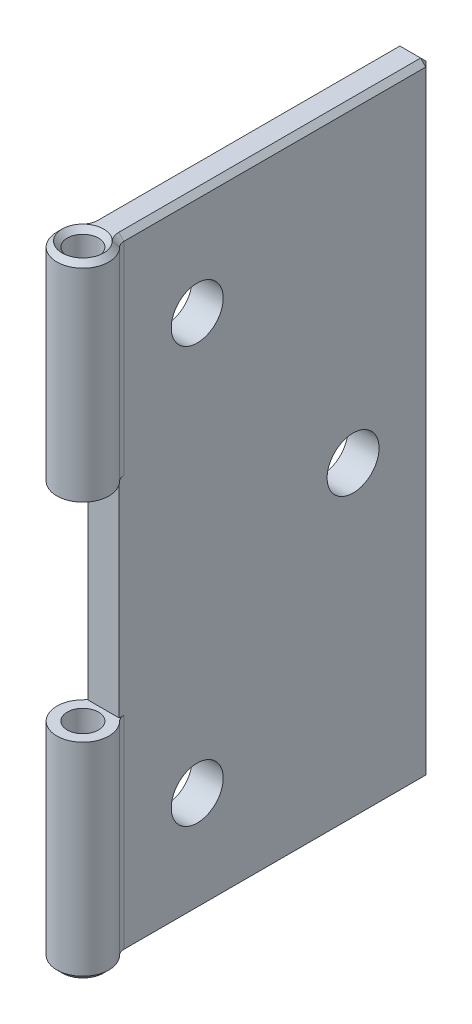
ISO-10303-21;
HEADER;
FILE_DESCRIPTION(('STEP AP214'),'2;1');
FILE_NAME('part.step','',(''),(''),'','','');
FILE_SCHEMA(('AUTOMOTIVE_DESIGN { 1 0 10303 214 1 1 1 1 }'));
ENDSEC;
DATA;
#1=APPLICATION_CONTEXT('core data for automotive mechanical design processes');
#2=APPLICATION_PROTOCOL_DEFINITION('international standard','automotive_design',2000,#1);
#3=PRODUCT_CONTEXT('',#1,'mechanical');
#4=PRODUCT('Part','Part','',(#3));
#5=PRODUCT_RELATED_PRODUCT_CATEGORY('part','',(#4));
#6=PRODUCT_DEFINITION_FORMATION('','',#4);
#7=PRODUCT_DEFINITION_CONTEXT('part definition',#1,'design');
#8=PRODUCT_DEFINITION('design','',#6,#7);
#9=PRODUCT_DEFINITION_SHAPE('','',#8);
#10=(LENGTH_UNIT() NAMED_UNIT(*) SI_UNIT(.MILLI.,.METRE.));
#11=(NAMED_UNIT(*) PLANE_ANGLE_UNIT() SI_UNIT($,.RADIAN.));
#12=(NAMED_UNIT(*) SI_UNIT($,.STERADIAN.) SOLID_ANGLE_UNIT());
#13=UNCERTAINTY_MEASURE_WITH_UNIT(LENGTH_MEASURE(1.E-05),#10,'distance_accuracy_value','');
#14=(GEOMETRIC_REPRESENTATION_CONTEXT(3) GLOBAL_UNCERTAINTY_ASSIGNED_CONTEXT((#13)) GLOBAL_UNIT_ASSIGNED_CONTEXT((#10,
#11,#12)) REPRESENTATION_CONTEXT('',''));
#15=CARTESIAN_POINT('',(0.,0.,0.));
#16=DIRECTION('',(0.,0.,1.));
#17=DIRECTION('',(1.,0.,0.));
#18=AXIS2_PLACEMENT_3D('',#15,#16,#17);
#19=CARTESIAN_POINT('',(1.5,-30.,15.));
#20=DIRECTION('',(0.,0.,-1.));
#21=DIRECTION('',(-1.,0.,0.));
#22=AXIS2_PLACEMENT_3D('',#19,#20,#21);
#23=PLANE('',#22);
#24=DIRECTION('',(-1.,0.,0.));
#25=VECTOR('',#24,1.);
#26=CARTESIAN_POINT('',(-1.5,-9.99999999999999,15.));
#27=LINE('',#26,#25);
#28=CARTESIAN_POINT('',(1.5,-9.99999999999999,15.));
#29=VERTEX_POINT('',#28);
#30=CARTESIAN_POINT('',(-1.5,-9.99999999999999,15.));
#31=VERTEX_POINT('',#30);
#32=EDGE_CURVE('E211',#29,#31,#27,.T.);
#33=ORIENTED_EDGE('',*,*,#32,.F.);
#34=DIRECTION('',(0.,-1.,0.));
#35=VECTOR('',#34,1.);
#36=CARTESIAN_POINT('',(1.5,-30.,15.));
#37=LINE('',#36,#35);
#38=CARTESIAN_POINT('',(1.5,9.99999999999999,15.));
#39=VERTEX_POINT('',#38);
#40=EDGE_CURVE('E226',#39,#29,#37,.T.);
#41=ORIENTED_EDGE('',*,*,#40,.F.);
#42=DIRECTION('',(-1.,0.,0.));
#43=VECTOR('',#42,1.);
#44=CARTESIAN_POINT('',(-1.5,9.99999999999999,15.));
#45=LINE('',#44,#43);
#46=CARTESIAN_POINT('',(-1.5,9.99999999999999,15.));
#47=VERTEX_POINT('',#46);
#48=EDGE_CURVE('E224',#39,#47,#45,.T.);
#49=ORIENTED_EDGE('',*,*,#48,.T.);
#50=DIRECTION('',(0.,-1.,0.));
#51=VECTOR('',#50,1.);
#52=CARTESIAN_POINT('',(-1.5,-30.,15.));
#53=LINE('',#52,#51);
#54=EDGE_CURVE('E201',#47,#31,#53,.T.);
#55=ORIENTED_EDGE('',*,*,#54,.T.);
#56=EDGE_LOOP('',(#33,#41,#49,#55));
#57=FACE_BOUND('',#56,.T.);
#58=ADVANCED_FACE('F55',(#57),#23,.F.);
#59=CARTESIAN_POINT('',(1.5,0.,0.));
#60=DIRECTION('',(1.,0.,0.));
#61=DIRECTION('',(0.,0.,-1.));
#62=AXIS2_PLACEMENT_3D('',#59,#60,#61);
#63=PLANE('',#62);
#64=CARTESIAN_POINT('',(1.5,0.,-7.5));
#65=DIRECTION('',(1.,0.,0.));
#66=DIRECTION('',(0.,0.,-1.));
#67=AXIS2_PLACEMENT_3D('',#64,#65,#66);
#68=CIRCLE('',#67,2.5);
#69=CARTESIAN_POINT('',(1.5,0.,-10.));
#70=VERTEX_POINT('',#69);
#71=EDGE_CURVE('E489',#70,#70,#68,.T.);
#72=ORIENTED_EDGE('',*,*,#71,.F.);
#73=EDGE_LOOP('',(#72));
#74=FACE_BOUND('',#73,.T.);
#75=DIRECTION('',(0.,-1.,0.));
#76=VECTOR('',#75,1.);
#77=CARTESIAN_POINT('',(1.5,0.,14.5505102572168));
#78=LINE('',#77,#76);
#79=CARTESIAN_POINT('',(1.5,-9.99999999999999,14.5505102572168));
#80=VERTEX_POINT('',#79);
#81=CARTESIAN_POINT('',(1.5,-29.5,14.5505102572168));
#82=VERTEX_POINT('',#81);
#83=EDGE_CURVE('E266',#80,#82,#78,.T.);
#84=ORIENTED_EDGE('',*,*,#83,.T.);
#85=DIRECTION('',(0.,0.,-1.));
#86=VECTOR('',#85,1.);
#87=CARTESIAN_POINT('',(1.5,-29.5,-15.));
#88=LINE('',#87,#86);
#89=CARTESIAN_POINT('',(1.5,-29.5,-14.5));
#90=VERTEX_POINT('',#89);
#91=EDGE_CURVE('E338',#82,#90,#88,.T.);
#92=ORIENTED_EDGE('',*,*,#91,.T.);
#93=DIRECTION('',(0.,1.,0.));
#94=VECTOR('',#93,1.);
#95=CARTESIAN_POINT('',(1.5,30.,-14.5));
#96=LINE('',#95,#94);
#97=CARTESIAN_POINT('',(1.5,29.5,-14.5));
#98=VERTEX_POINT('',#97);
#99=EDGE_CURVE('E335',#90,#98,#96,.T.);
#100=ORIENTED_EDGE('',*,*,#99,.T.);
#101=DIRECTION('',(0.,0.,1.));
#102=VECTOR('',#101,1.);
#103=CARTESIAN_POINT('',(1.5,29.5,14.5505102572168));
#104=LINE('',#103,#102);
#105=CARTESIAN_POINT('',(1.5,29.5,14.5505102572168));
#106=VERTEX_POINT('',#105);
#107=EDGE_CURVE('E332',#98,#106,#104,.T.);
#108=ORIENTED_EDGE('',*,*,#107,.T.);
#109=DIRECTION('',(0.,-1.,0.));
#110=VECTOR('',#109,1.);
#111=CARTESIAN_POINT('',(1.5,9.99999999999999,14.5505102572168));
#112=LINE('',#111,#110);
#113=CARTESIAN_POINT('',(1.5,9.99999999999999,14.5505102572168));
#114=VERTEX_POINT('',#113);
#115=EDGE_CURVE('E261',#106,#114,#112,.T.);
#116=ORIENTED_EDGE('',*,*,#115,.T.);
#117=DIRECTION('',(0.,0.,1.));
#118=VECTOR('',#117,1.);
#119=CARTESIAN_POINT('',(1.5,10.,0.));
#120=LINE('',#119,#118);
#121=EDGE_CURVE('E258',#114,#39,#120,.T.);
#122=ORIENTED_EDGE('',*,*,#121,.T.);
#123=ORIENTED_EDGE('',*,*,#40,.T.);
#124=DIRECTION('',(0.,0.,-1.));
#125=VECTOR('',#124,1.);
#126=CARTESIAN_POINT('',(1.5,-10.,0.));
#127=LINE('',#126,#125);
#128=EDGE_CURVE('E215',#29,#80,#127,.T.);
#129=ORIENTED_EDGE('',*,*,#128,.T.);
#130=EDGE_LOOP('',(#84,#92,#100,#108,#116,#122,#123,#129));
#131=FACE_BOUND('',#130,.T.);
#132=CARTESIAN_POINT('',(1.5,20.,7.5));
#133=DIRECTION('',(1.,0.,0.));
#134=DIRECTION('',(0.,0.,-1.));
#135=AXIS2_PLACEMENT_3D('',#132,#133,#134);
#136=CIRCLE('',#135,2.5);
#137=CARTESIAN_POINT('',(1.5,20.,5.));
#138=VERTEX_POINT('',#137);
#139=EDGE_CURVE('E227',#138,#138,#136,.T.);
#140=ORIENTED_EDGE('',*,*,#139,.F.);
#141=EDGE_LOOP('',(#140));
#142=FACE_BOUND('',#141,.T.);
#143=CARTESIAN_POINT('',(1.5,-20.,7.5));
#144=DIRECTION('',(1.,0.,0.));
#145=DIRECTION('',(0.,0.,-1.));
#146=AXIS2_PLACEMENT_3D('',#143,#144,#145);
#147=CIRCLE('',#146,2.5);
#148=CARTESIAN_POINT('',(1.5,-20.,5.));
#149=VERTEX_POINT('',#148);
#150=EDGE_CURVE('E481',#149,#149,#147,.T.);
#151=ORIENTED_EDGE('',*,*,#150,.F.);
#152=EDGE_LOOP('',(#151));
#153=FACE_BOUND('',#152,.T.);
#154=ADVANCED_FACE('F518',(#74,#131,#142,#153),#63,.T.);
#155=CARTESIAN_POINT('',(-1.5,0.,0.));
#156=DIRECTION('',(1.,0.,0.));
#157=DIRECTION('',(0.,0.,-1.));
#158=AXIS2_PLACEMENT_3D('',#155,#156,#157);
#159=PLANE('',#158);
#160=DIRECTION('',(0.,-1.,0.));
#161=VECTOR('',#160,1.);
#162=CARTESIAN_POINT('',(-1.5,0.,-14.5));
#163=LINE('',#162,#161);
#164=CARTESIAN_POINT('',(-1.5,29.5,-14.5));
#165=VERTEX_POINT('',#164);
#166=CARTESIAN_POINT('',(-1.5,-29.5,-14.5));
#167=VERTEX_POINT('',#166);
#168=EDGE_CURVE('E350',#165,#167,#163,.T.);
#169=ORIENTED_EDGE('',*,*,#168,.T.);
#170=DIRECTION('',(0.,0.,1.));
#171=VECTOR('',#170,1.);
#172=CARTESIAN_POINT('',(-1.5,-29.5,0.));
#173=LINE('',#172,#171);
#174=CARTESIAN_POINT('',(-1.5,-29.5,14.5505102572168));
#175=VERTEX_POINT('',#174);
#176=EDGE_CURVE('E353',#167,#175,#173,.T.);
#177=ORIENTED_EDGE('',*,*,#176,.T.);
#178=DIRECTION('',(0.,1.,0.));
#179=VECTOR('',#178,1.);
#180=CARTESIAN_POINT('',(-1.5,-9.99999999999999,14.5505102572168));
#181=LINE('',#180,#179);
#182=CARTESIAN_POINT('',(-1.5,-9.99999999999999,14.5505102572168));
#183=VERTEX_POINT('',#182);
#184=EDGE_CURVE('E204',#175,#183,#181,.T.);
#185=ORIENTED_EDGE('',*,*,#184,.T.);
#186=DIRECTION('',(0.,0.,1.));
#187=VECTOR('',#186,1.);
#188=CARTESIAN_POINT('',(-1.5,-9.99999999999999,17.));
#189=LINE('',#188,#187);
#190=EDGE_CURVE('E195',#183,#31,#189,.T.);
#191=ORIENTED_EDGE('',*,*,#190,.T.);
#192=ORIENTED_EDGE('',*,*,#54,.F.);
#193=DIRECTION('',(0.,0.,-1.));
#194=VECTOR('',#193,1.);
#195=CARTESIAN_POINT('',(-1.5,9.99999999999999,17.));
#196=LINE('',#195,#194);
#197=CARTESIAN_POINT('',(-1.5,9.99999999999999,14.5505102572168));
#198=VERTEX_POINT('',#197);
#199=EDGE_CURVE('E208',#47,#198,#196,.T.);
#200=ORIENTED_EDGE('',*,*,#199,.T.);
#201=DIRECTION('',(0.,1.,0.));
#202=VECTOR('',#201,1.);
#203=CARTESIAN_POINT('',(-1.5,0.,14.5505102572168));
#204=LINE('',#203,#202);
#205=CARTESIAN_POINT('',(-1.5,29.5,14.5505102572168));
#206=VERTEX_POINT('',#205);
#207=EDGE_CURVE('E244',#198,#206,#204,.T.);
#208=ORIENTED_EDGE('',*,*,#207,.T.);
#209=DIRECTION('',(0.,0.,-1.));
#210=VECTOR('',#209,1.);
#211=CARTESIAN_POINT('',(-1.5,29.5,0.));
#212=LINE('',#211,#210);
#213=EDGE_CURVE('E347',#206,#165,#212,.T.);
#214=ORIENTED_EDGE('',*,*,#213,.T.);
#215=EDGE_LOOP('',(#169,#177,#185,#191,#192,#200,#208,#214));
#216=FACE_BOUND('',#215,.T.);
#217=CARTESIAN_POINT('',(-1.5,20.,7.5));
#218=DIRECTION('',(1.,0.,0.));
#219=DIRECTION('',(0.,0.,-1.));
#220=AXIS2_PLACEMENT_3D('',#217,#218,#219);
#221=CIRCLE('',#220,2.5);
#222=CARTESIAN_POINT('',(-1.5,20.,5.));
#223=VERTEX_POINT('',#222);
#224=EDGE_CURVE('E234',#223,#223,#221,.T.);
#225=ORIENTED_EDGE('',*,*,#224,.T.);
#226=EDGE_LOOP('',(#225));
#227=FACE_BOUND('',#226,.T.);
#228=CARTESIAN_POINT('',(-1.5,0.,-7.5));
#229=DIRECTION('',(1.,0.,0.));
#230=DIRECTION('',(0.,0.,-1.));
#231=AXIS2_PLACEMENT_3D('',#228,#229,#230);
#232=CIRCLE('',#231,2.5);
#233=CARTESIAN_POINT('',(-1.5,0.,-10.));
#234=VERTEX_POINT('',#233);
#235=EDGE_CURVE('E485',#234,#234,#232,.T.);
#236=ORIENTED_EDGE('',*,*,#235,.T.);
#237=EDGE_LOOP('',(#236));
#238=FACE_BOUND('',#237,.T.);
#239=CARTESIAN_POINT('',(-1.5,-20.,7.5));
#240=DIRECTION('',(1.,0.,0.));
#241=DIRECTION('',(0.,0.,-1.));
#242=AXIS2_PLACEMENT_3D('',#239,#240,#241);
#243=CIRCLE('',#242,2.5);
#244=CARTESIAN_POINT('',(-1.5,-20.,5.));
#245=VERTEX_POINT('',#244);
#246=EDGE_CURVE('E480',#245,#245,#243,.T.);
#247=ORIENTED_EDGE('',*,*,#246,.T.);
#248=EDGE_LOOP('',(#247));
#249=FACE_BOUND('',#248,.T.);
#250=ADVANCED_FACE('F197',(#216,#227,#238,#249),#159,.F.);
#251=CARTESIAN_POINT('',(1.5,-30.,-15.));
#252=DIRECTION('',(0.,1.,0.));
#253=DIRECTION('',(0.,0.,1.));
#254=AXIS2_PLACEMENT_3D('',#251,#252,#253);
#255=PLANE('',#254);
#256=CARTESIAN_POINT('',(2.5,-30.,14.5505102572168));
#257=DIRECTION('',(0.,1.,0.));
#258=DIRECTION('',(0.,0.,1.));
#259=AXIS2_PLACEMENT_3D('',#256,#257,#258);
#260=CIRCLE('',#259,1.50000000000001);
#261=CARTESIAN_POINT('',(0.999999999999993,-30.,14.5505102572168));
#262=VERTEX_POINT('',#261);
#263=CARTESIAN_POINT('',(1.42857142857142,-30.,15.6002915755525));
#264=VERTEX_POINT('',#263);
#265=EDGE_CURVE('E294',#262,#264,#260,.T.);
#266=ORIENTED_EDGE('',*,*,#265,.T.);
#267=CARTESIAN_POINT('',(0.,-30.,17.));
#268=DIRECTION('',(0.,1.,0.));
#269=DIRECTION('',(0.,0.,1.));
#270=AXIS2_PLACEMENT_3D('',#267,#268,#269);
#271=CIRCLE('',#270,2.);
#272=CARTESIAN_POINT('',(-1.42857142857142,-30.,15.6002915755525));
#273=VERTEX_POINT('',#272);
#274=EDGE_CURVE('E297',#264,#273,#271,.T.);
#275=ORIENTED_EDGE('',*,*,#274,.T.);
#276=CARTESIAN_POINT('',(-2.5,-30.,14.5505102572168));
#277=DIRECTION('',(0.,1.,0.));
#278=DIRECTION('',(0.,0.,1.));
#279=AXIS2_PLACEMENT_3D('',#276,#277,#278);
#280=CIRCLE('',#279,1.50000000000001);
#281=CARTESIAN_POINT('',(-0.999999999999993,-30.,14.5505102572168));
#282=VERTEX_POINT('',#281);
#283=EDGE_CURVE('E288',#273,#282,#280,.T.);
#284=ORIENTED_EDGE('',*,*,#283,.T.);
#285=DIRECTION('',(0.,0.,-1.));
#286=VECTOR('',#285,1.);
#287=CARTESIAN_POINT('',(-0.999999999999993,-30.,-15.));
#288=LINE('',#287,#286);
#289=CARTESIAN_POINT('',(-0.999999999999993,-30.,-14.5));
#290=VERTEX_POINT('',#289);
#291=EDGE_CURVE('E285',#282,#290,#288,.T.);
#292=ORIENTED_EDGE('',*,*,#291,.T.);
#293=DIRECTION('',(1.,0.,0.));
#294=VECTOR('',#293,1.);
#295=CARTESIAN_POINT('',(1.5,-30.,-14.5));
#296=LINE('',#295,#294);
#297=CARTESIAN_POINT('',(0.999999999999993,-30.,-14.5));
#298=VERTEX_POINT('',#297);
#299=EDGE_CURVE('E282',#290,#298,#296,.T.);
#300=ORIENTED_EDGE('',*,*,#299,.T.);
#301=DIRECTION('',(0.,0.,1.));
#302=VECTOR('',#301,1.);
#303=CARTESIAN_POINT('',(0.999999999999993,-30.,14.5505102572168));
#304=LINE('',#303,#302);
#305=EDGE_CURVE('E291',#298,#262,#304,.T.);
#306=ORIENTED_EDGE('',*,*,#305,.T.);
#307=EDGE_LOOP('',(#266,#275,#284,#292,#300,#306));
#308=FACE_BOUND('',#307,.T.);
#309=ADVANCED_FACE('F526',(#308),#255,.F.);
#310=CARTESIAN_POINT('',(1.5,-30.,-15.));
#311=DIRECTION('',(0.,0.,1.));
#312=DIRECTION('',(1.,0.,0.));
#313=AXIS2_PLACEMENT_3D('',#310,#311,#312);
#314=PLANE('',#313);
#315=DIRECTION('',(0.,-1.,0.));
#316=VECTOR('',#315,1.);
#317=CARTESIAN_POINT('',(0.999999999999993,-30.,-15.));
#318=LINE('',#317,#316);
#319=CARTESIAN_POINT('',(0.999999999999993,29.5,-15.));
#320=VERTEX_POINT('',#319);
#321=CARTESIAN_POINT('',(0.999999999999993,-29.5,-15.));
#322=VERTEX_POINT('',#321);
#323=EDGE_CURVE('E362',#320,#322,#318,.T.);
#324=ORIENTED_EDGE('',*,*,#323,.T.);
#325=DIRECTION('',(-1.,0.,0.));
#326=VECTOR('',#325,1.);
#327=CARTESIAN_POINT('',(1.5,-29.5,-15.));
#328=LINE('',#327,#326);
#329=CARTESIAN_POINT('',(-0.999999999999993,-29.5,-15.));
#330=VERTEX_POINT('',#329);
#331=EDGE_CURVE('E365',#322,#330,#328,.T.);
#332=ORIENTED_EDGE('',*,*,#331,.T.);
#333=DIRECTION('',(0.,1.,0.));
#334=VECTOR('',#333,1.);
#335=CARTESIAN_POINT('',(-0.999999999999993,-30.,-15.));
#336=LINE('',#335,#334);
#337=CARTESIAN_POINT('',(-0.999999999999993,29.5,-15.));
#338=VERTEX_POINT('',#337);
#339=EDGE_CURVE('E359',#330,#338,#336,.T.);
#340=ORIENTED_EDGE('',*,*,#339,.T.);
#341=DIRECTION('',(1.,0.,0.));
#342=VECTOR('',#341,1.);
#343=CARTESIAN_POINT('',(1.5,29.5,-15.));
#344=LINE('',#343,#342);
#345=EDGE_CURVE('E356',#338,#320,#344,.T.);
#346=ORIENTED_EDGE('',*,*,#345,.T.);
#347=EDGE_LOOP('',(#324,#332,#340,#346));
#348=FACE_BOUND('',#347,.T.);
#349=ADVANCED_FACE('F513',(#348),#314,.F.);
#350=CARTESIAN_POINT('',(1.5,30.,-15.));
#351=DIRECTION('',(0.,-1.,0.));
#352=DIRECTION('',(0.,0.,-1.));
#353=AXIS2_PLACEMENT_3D('',#350,#351,#352);
#354=PLANE('',#353);
#355=CARTESIAN_POINT('',(2.5,30.,14.5505102572168));
#356=DIRECTION('',(0.,-1.,0.));
#357=DIRECTION('',(0.,0.,-1.));
#358=AXIS2_PLACEMENT_3D('',#355,#356,#357);
#359=CIRCLE('',#358,1.50000000000001);
#360=CARTESIAN_POINT('',(1.42857142857142,30.,15.6002915755525));
#361=VERTEX_POINT('',#360);
#362=CARTESIAN_POINT('',(0.999999999999993,30.,14.5505102572168));
#363=VERTEX_POINT('',#362);
#364=EDGE_CURVE('E322',#361,#363,#359,.T.);
#365=ORIENTED_EDGE('',*,*,#364,.T.);
#366=DIRECTION('',(0.,0.,-1.));
#367=VECTOR('',#366,1.);
#368=CARTESIAN_POINT('',(0.999999999999993,30.,-15.));
#369=LINE('',#368,#367);
#370=CARTESIAN_POINT('',(0.999999999999993,30.,-14.5));
#371=VERTEX_POINT('',#370);
#372=EDGE_CURVE('E325',#363,#371,#369,.T.);
#373=ORIENTED_EDGE('',*,*,#372,.T.);
#374=DIRECTION('',(-1.,0.,0.));
#375=VECTOR('',#374,1.);
#376=CARTESIAN_POINT('',(1.5,30.,-14.5));
#377=LINE('',#376,#375);
#378=CARTESIAN_POINT('',(-0.999999999999993,30.,-14.5));
#379=VERTEX_POINT('',#378);
#380=EDGE_CURVE('E315',#371,#379,#377,.T.);
#381=ORIENTED_EDGE('',*,*,#380,.T.);
#382=DIRECTION('',(0.,0.,1.));
#383=VECTOR('',#382,1.);
#384=CARTESIAN_POINT('',(-0.999999999999993,30.,-15.));
#385=LINE('',#384,#383);
#386=CARTESIAN_POINT('',(-0.999999999999993,30.,14.5505102572168));
#387=VERTEX_POINT('',#386);
#388=EDGE_CURVE('E309',#379,#387,#385,.T.);
#389=ORIENTED_EDGE('',*,*,#388,.T.);
#390=CARTESIAN_POINT('',(-2.5,30.,14.5505102572168));
#391=DIRECTION('',(0.,-1.,0.));
#392=DIRECTION('',(0.,0.,-1.));
#393=AXIS2_PLACEMENT_3D('',#390,#391,#392);
#394=CIRCLE('',#393,1.50000000000001);
#395=CARTESIAN_POINT('',(-1.42857142857142,30.,15.6002915755525));
#396=VERTEX_POINT('',#395);
#397=EDGE_CURVE('E312',#387,#396,#394,.T.);
#398=ORIENTED_EDGE('',*,*,#397,.T.);
#399=CARTESIAN_POINT('',(0.,30.,17.));
#400=DIRECTION('',(0.,-1.,0.));
#401=DIRECTION('',(0.,0.,-1.));
#402=AXIS2_PLACEMENT_3D('',#399,#400,#401);
#403=CIRCLE('',#402,1.99999999999998);
#404=EDGE_CURVE('E318',#396,#361,#403,.T.);
#405=ORIENTED_EDGE('',*,*,#404,.T.);
#406=EDGE_LOOP('',(#365,#373,#381,#389,#398,#405));
#407=FACE_BOUND('',#406,.T.);
#408=ADVANCED_FACE('F503',(#407),#354,.F.);
#409=CARTESIAN_POINT('',(1.5,20.,7.5));
#410=DIRECTION('',(-1.,0.,0.));
#411=DIRECTION('',(0.,0.,1.));
#412=AXIS2_PLACEMENT_3D('',#409,#410,#411);
#413=CYLINDRICAL_SURFACE('',#412,2.5);
#414=ORIENTED_EDGE('',*,*,#139,.T.);
#415=EDGE_LOOP('',(#414));
#416=FACE_BOUND('',#415,.T.);
#417=ORIENTED_EDGE('',*,*,#224,.F.);
#418=EDGE_LOOP('',(#417));
#419=FACE_BOUND('',#418,.T.);
#420=ADVANCED_FACE('F500',(#416,#419),#413,.F.);
#421=CARTESIAN_POINT('',(1.5,0.,-7.5));
#422=DIRECTION('',(-1.,0.,0.));
#423=DIRECTION('',(0.,0.,1.));
#424=AXIS2_PLACEMENT_3D('',#421,#422,#423);
#425=CYLINDRICAL_SURFACE('',#424,2.5);
#426=ORIENTED_EDGE('',*,*,#71,.T.);
#427=EDGE_LOOP('',(#426));
#428=FACE_BOUND('',#427,.T.);
#429=ORIENTED_EDGE('',*,*,#235,.F.);
#430=EDGE_LOOP('',(#429));
#431=FACE_BOUND('',#430,.T.);
#432=ADVANCED_FACE('F502',(#428,#431),#425,.F.);
#433=CARTESIAN_POINT('',(1.5,-20.,7.5));
#434=DIRECTION('',(-1.,0.,0.));
#435=DIRECTION('',(0.,0.,1.));
#436=AXIS2_PLACEMENT_3D('',#433,#434,#435);
#437=CYLINDRICAL_SURFACE('',#436,2.5);
#438=ORIENTED_EDGE('',*,*,#150,.T.);
#439=EDGE_LOOP('',(#438));
#440=FACE_BOUND('',#439,.T.);
#441=ORIENTED_EDGE('',*,*,#246,.F.);
#442=EDGE_LOOP('',(#441));
#443=FACE_BOUND('',#442,.T.);
#444=ADVANCED_FACE('F510',(#440,#443),#437,.F.);
#445=CARTESIAN_POINT('',(0.,9.99999999999999,17.));
#446=DIRECTION('',(0.,1.,0.));
#447=DIRECTION('',(0.,0.,1.));
#448=AXIS2_PLACEMENT_3D('',#445,#446,#447);
#449=CYLINDRICAL_SURFACE('',#448,2.5);
#450=DIRECTION('',(0.,1.,0.));
#451=VECTOR('',#450,1.);
#452=CARTESIAN_POINT('',(1.78571428571429,9.99999999999999,15.2503644694406));
#453=LINE('',#452,#451);
#454=CARTESIAN_POINT('',(1.78571428571429,9.99999999999999,15.2503644694406));
#455=VERTEX_POINT('',#454);
#456=CARTESIAN_POINT('',(1.78571428571429,29.5,15.2503644694406));
#457=VERTEX_POINT('',#456);
#458=EDGE_CURVE('E252',#455,#457,#453,.T.);
#459=ORIENTED_EDGE('',*,*,#458,.T.);
#460=CARTESIAN_POINT('',(0.,29.5,17.));
#461=DIRECTION('',(0.,-1.,0.));
#462=DIRECTION('',(0.,0.,-1.));
#463=AXIS2_PLACEMENT_3D('',#460,#461,#462);
#464=CIRCLE('',#463,2.5);
#465=CARTESIAN_POINT('',(-1.78571428571429,29.5,15.2503644694406));
#466=VERTEX_POINT('',#465);
#467=EDGE_CURVE('E65',#457,#466,#464,.T.);
#468=ORIENTED_EDGE('',*,*,#467,.T.);
#469=DIRECTION('',(0.,1.,0.));
#470=VECTOR('',#469,1.);
#471=CARTESIAN_POINT('',(-1.78571428571429,9.99999999999999,15.2503644694406));
#472=LINE('',#471,#470);
#473=CARTESIAN_POINT('',(-1.78571428571429,9.99999999999999,15.2503644694406));
#474=VERTEX_POINT('',#473);
#475=EDGE_CURVE('E255',#466,#474,#472,.F.);
#476=ORIENTED_EDGE('',*,*,#475,.T.);
#477=CARTESIAN_POINT('',(0.,9.99999999999999,17.));
#478=DIRECTION('',(0.,1.,0.));
#479=DIRECTION('',(0.,0.,1.));
#480=AXIS2_PLACEMENT_3D('',#477,#478,#479);
#481=CIRCLE('',#480,2.5);
#482=EDGE_CURVE('E474',#474,#455,#481,.T.);
#483=ORIENTED_EDGE('',*,*,#482,.T.);
#484=EDGE_LOOP('',(#459,#468,#476,#483));
#485=FACE_BOUND('',#484,.T.);
#486=ADVANCED_FACE('F634',(#485),#449,.T.);
#487=CARTESIAN_POINT('',(0.,9.99999999999999,17.));
#488=DIRECTION('',(0.,1.,0.));
#489=DIRECTION('',(0.,0.,1.));
#490=AXIS2_PLACEMENT_3D('',#487,#488,#489);
#491=PLANE('',#490);
#492=CARTESIAN_POINT('',(0.,9.99999999999999,17.));
#493=DIRECTION('',(0.,1.,0.));
#494=DIRECTION('',(0.,0.,1.));
#495=AXIS2_PLACEMENT_3D('',#492,#493,#494);
#496=CIRCLE('',#495,1.5);
#497=CARTESIAN_POINT('',(0.,9.99999999999999,18.5));
#498=VERTEX_POINT('',#497);
#499=EDGE_CURVE('E220',#498,#498,#496,.T.);
#500=ORIENTED_EDGE('',*,*,#499,.T.);
#501=EDGE_LOOP('',(#500));
#502=FACE_BOUND('',#501,.T.);
#503=ORIENTED_EDGE('',*,*,#482,.F.);
#504=CARTESIAN_POINT('',(-2.5,9.99999999999999,14.5505102572168));
#505=DIRECTION('',(0.,1.,0.));
#506=DIRECTION('',(0.,0.,1.));
#507=AXIS2_PLACEMENT_3D('',#504,#505,#506);
#508=CIRCLE('',#507,1.);
#509=EDGE_CURVE('E273',#474,#198,#508,.T.);
#510=ORIENTED_EDGE('',*,*,#509,.T.);
#511=ORIENTED_EDGE('',*,*,#199,.F.);
#512=ORIENTED_EDGE('',*,*,#48,.F.);
#513=ORIENTED_EDGE('',*,*,#121,.F.);
#514=CARTESIAN_POINT('',(2.5,9.99999999999999,14.5505102572168));
#515=DIRECTION('',(0.,1.,0.));
#516=DIRECTION('',(0.,0.,1.));
#517=AXIS2_PLACEMENT_3D('',#514,#515,#516);
#518=CIRCLE('',#517,1.);
#519=EDGE_CURVE('E279',#114,#455,#518,.T.);
#520=ORIENTED_EDGE('',*,*,#519,.T.);
#521=EDGE_LOOP('',(#503,#510,#511,#512,#513,#520));
#522=FACE_BOUND('',#521,.T.);
#523=ADVANCED_FACE('F638',(#502,#522),#491,.F.);
#524=CARTESIAN_POINT('',(0.,9.99999999999999,17.));
#525=DIRECTION('',(0.,1.,0.));
#526=DIRECTION('',(0.,0.,1.));
#527=AXIS2_PLACEMENT_3D('',#524,#525,#526);
#528=CYLINDRICAL_SURFACE('',#527,1.5);
#529=CARTESIAN_POINT('',(0.,29.5,17.));
#530=DIRECTION('',(0.,-1.,0.));
#531=DIRECTION('',(0.,0.,-1.));
#532=AXIS2_PLACEMENT_3D('',#529,#530,#531);
#533=CIRCLE('',#532,1.5);
#534=CARTESIAN_POINT('',(0.,29.5,15.5));
#535=VERTEX_POINT('',#534);
#536=EDGE_CURVE('E305',#535,#535,#533,.F.);
#537=ORIENTED_EDGE('',*,*,#536,.T.);
#538=EDGE_LOOP('',(#537));
#539=FACE_BOUND('',#538,.T.);
#540=ORIENTED_EDGE('',*,*,#499,.F.);
#541=EDGE_LOOP('',(#540));
#542=FACE_BOUND('',#541,.T.);
#543=ADVANCED_FACE('F705',(#539,#542),#528,.F.);
#544=CARTESIAN_POINT('',(0.,-9.99999999999999,17.));
#545=DIRECTION('',(0.,-1.,0.));
#546=DIRECTION('',(0.,0.,1.));
#547=AXIS2_PLACEMENT_3D('',#544,#545,#546);
#548=PLANE('',#547);
#549=ORIENTED_EDGE('',*,*,#32,.T.);
#550=ORIENTED_EDGE('',*,*,#190,.F.);
#551=CARTESIAN_POINT('',(-2.5,-9.99999999999999,14.5505102572168));
#552=DIRECTION('',(0.,-1.,0.));
#553=DIRECTION('',(0.,0.,-1.));
#554=AXIS2_PLACEMENT_3D('',#551,#552,#553);
#555=CIRCLE('',#554,1.);
#556=CARTESIAN_POINT('',(-1.78571428571429,-9.99999999999999,15.2503644694406));
#557=VERTEX_POINT('',#556);
#558=EDGE_CURVE('E270',#183,#557,#555,.T.);
#559=ORIENTED_EDGE('',*,*,#558,.T.);
#560=CARTESIAN_POINT('',(0.,-9.99999999999999,17.));
#561=DIRECTION('',(0.,1.,0.));
#562=DIRECTION('',(0.,0.,1.));
#563=AXIS2_PLACEMENT_3D('',#560,#561,#562);
#564=CIRCLE('',#563,2.5);
#565=CARTESIAN_POINT('',(1.78571428571429,-9.99999999999999,15.2503644694406));
#566=VERTEX_POINT('',#565);
#567=EDGE_CURVE('E221',#557,#566,#564,.T.);
#568=ORIENTED_EDGE('',*,*,#567,.T.);
#569=CARTESIAN_POINT('',(2.5,-9.99999999999999,14.5505102572168));
#570=DIRECTION('',(0.,-1.,0.));
#571=DIRECTION('',(0.,0.,-1.));
#572=AXIS2_PLACEMENT_3D('',#569,#570,#571);
#573=CIRCLE('',#572,1.);
#574=EDGE_CURVE('E276',#566,#80,#573,.T.);
#575=ORIENTED_EDGE('',*,*,#574,.T.);
#576=ORIENTED_EDGE('',*,*,#128,.F.);
#577=EDGE_LOOP('',(#549,#550,#559,#568,#575,#576));
#578=FACE_BOUND('',#577,.T.);
#579=CARTESIAN_POINT('',(0.,-9.99999999999999,17.));
#580=DIRECTION('',(0.,1.,0.));
#581=DIRECTION('',(0.,0.,1.));
#582=AXIS2_PLACEMENT_3D('',#579,#580,#581);
#583=CIRCLE('',#582,1.5);
#584=CARTESIAN_POINT('',(0.,-9.99999999999999,18.5));
#585=VERTEX_POINT('',#584);
#586=EDGE_CURVE('E458',#585,#585,#583,.T.);
#587=ORIENTED_EDGE('',*,*,#586,.F.);
#588=EDGE_LOOP('',(#587));
#589=FACE_BOUND('',#588,.T.);
#590=ADVANCED_FACE('F212',(#578,#589),#548,.F.);
#591=CARTESIAN_POINT('',(0.,-9.99999999999999,17.));
#592=DIRECTION('',(0.,-1.,0.));
#593=DIRECTION('',(0.,0.,-1.));
#594=AXIS2_PLACEMENT_3D('',#591,#592,#593);
#595=CYLINDRICAL_SURFACE('',#594,2.5);
#596=DIRECTION('',(0.,-1.,0.));
#597=VECTOR('',#596,1.);
#598=CARTESIAN_POINT('',(-1.78571428571429,-9.99999999999999,15.2503644694406));
#599=LINE('',#598,#597);
#600=CARTESIAN_POINT('',(-1.78571428571429,-29.5,15.2503644694406));
#601=VERTEX_POINT('',#600);
#602=EDGE_CURVE('E240',#557,#601,#599,.T.);
#603=ORIENTED_EDGE('',*,*,#602,.T.);
#604=CARTESIAN_POINT('',(0.,-29.5,17.));
#605=DIRECTION('',(0.,1.,0.));
#606=DIRECTION('',(0.,0.,1.));
#607=AXIS2_PLACEMENT_3D('',#604,#605,#606);
#608=CIRCLE('',#607,2.5);
#609=CARTESIAN_POINT('',(1.78571428571429,-29.5,15.2503644694406));
#610=VERTEX_POINT('',#609);
#611=EDGE_CURVE('E341',#601,#610,#608,.T.);
#612=ORIENTED_EDGE('',*,*,#611,.T.);
#613=DIRECTION('',(0.,-1.,0.));
#614=VECTOR('',#613,1.);
#615=CARTESIAN_POINT('',(1.78571428571429,-9.99999999999999,15.2503644694406));
#616=LINE('',#615,#614);
#617=EDGE_CURVE('E231',#610,#566,#616,.F.);
#618=ORIENTED_EDGE('',*,*,#617,.T.);
#619=ORIENTED_EDGE('',*,*,#567,.F.);
#620=EDGE_LOOP('',(#603,#612,#618,#619));
#621=FACE_BOUND('',#620,.T.);
#622=ADVANCED_FACE('F667',(#621),#595,.T.);
#623=CARTESIAN_POINT('',(0.,-9.99999999999999,17.));
#624=DIRECTION('',(0.,-1.,0.));
#625=DIRECTION('',(0.,0.,-1.));
#626=AXIS2_PLACEMENT_3D('',#623,#624,#625);
#627=CYLINDRICAL_SURFACE('',#626,1.5);
#628=CARTESIAN_POINT('',(0.,-29.5,17.));
#629=DIRECTION('',(0.,1.,0.));
#630=DIRECTION('',(0.,0.,1.));
#631=AXIS2_PLACEMENT_3D('',#628,#629,#630);
#632=CIRCLE('',#631,1.5);
#633=CARTESIAN_POINT('',(0.,-29.5,18.5));
#634=VERTEX_POINT('',#633);
#635=EDGE_CURVE('E301',#634,#634,#632,.F.);
#636=ORIENTED_EDGE('',*,*,#635,.T.);
#637=EDGE_LOOP('',(#636));
#638=FACE_BOUND('',#637,.T.);
#639=ORIENTED_EDGE('',*,*,#586,.T.);
#640=EDGE_LOOP('',(#639));
#641=FACE_BOUND('',#640,.T.);
#642=ADVANCED_FACE('F532',(#638,#641),#627,.F.);
#643=CARTESIAN_POINT('',(-2.5,-9.99999999999999,14.5505102572168));
#644=DIRECTION('',(0.,-1.,0.));
#645=DIRECTION('',(0.,0.,-1.));
#646=AXIS2_PLACEMENT_3D('',#643,#644,#645);
#647=CYLINDRICAL_SURFACE('',#646,1.);
#648=ORIENTED_EDGE('',*,*,#184,.F.);
#649=CARTESIAN_POINT('',(-2.5,-29.5,14.5505102572168));
#650=DIRECTION('',(0.,1.,0.));
#651=DIRECTION('',(0.,0.,1.));
#652=AXIS2_PLACEMENT_3D('',#649,#650,#651);
#653=CIRCLE('',#652,1.);
#654=EDGE_CURVE('E344',#175,#601,#653,.F.);
#655=ORIENTED_EDGE('',*,*,#654,.T.);
#656=ORIENTED_EDGE('',*,*,#602,.F.);
#657=ORIENTED_EDGE('',*,*,#558,.F.);
#658=EDGE_LOOP('',(#648,#655,#656,#657));
#659=FACE_BOUND('',#658,.T.);
#660=ADVANCED_FACE('F528',(#659),#647,.F.);
#661=CARTESIAN_POINT('',(-2.5,9.99999999999999,14.5505102572168));
#662=DIRECTION('',(0.,1.,0.));
#663=DIRECTION('',(0.,0.,1.));
#664=AXIS2_PLACEMENT_3D('',#661,#662,#663);
#665=CYLINDRICAL_SURFACE('',#664,1.);
#666=ORIENTED_EDGE('',*,*,#475,.F.);
#667=CARTESIAN_POINT('',(-2.5,29.5,14.5505102572168));
#668=DIRECTION('',(0.,-1.,0.));
#669=DIRECTION('',(0.,0.,-1.));
#670=AXIS2_PLACEMENT_3D('',#667,#668,#669);
#671=CIRCLE('',#670,1.);
#672=EDGE_CURVE('E13',#466,#206,#671,.F.);
#673=ORIENTED_EDGE('',*,*,#672,.T.);
#674=ORIENTED_EDGE('',*,*,#207,.F.);
#675=ORIENTED_EDGE('',*,*,#509,.F.);
#676=EDGE_LOOP('',(#666,#673,#674,#675));
#677=FACE_BOUND('',#676,.T.);
#678=ADVANCED_FACE('F531',(#677),#665,.F.);
#679=CARTESIAN_POINT('',(2.5,-9.99999999999999,14.5505102572168));
#680=DIRECTION('',(0.,-1.,0.));
#681=DIRECTION('',(0.,0.,-1.));
#682=AXIS2_PLACEMENT_3D('',#679,#680,#681);
#683=CYLINDRICAL_SURFACE('',#682,1.);
#684=ORIENTED_EDGE('',*,*,#617,.F.);
#685=CARTESIAN_POINT('',(2.5,-29.5,14.5505102572168));
#686=DIRECTION('',(0.,1.,0.));
#687=DIRECTION('',(0.,0.,1.));
#688=AXIS2_PLACEMENT_3D('',#685,#686,#687);
#689=CIRCLE('',#688,1.);
#690=EDGE_CURVE('E328',#610,#82,#689,.F.);
#691=ORIENTED_EDGE('',*,*,#690,.T.);
#692=ORIENTED_EDGE('',*,*,#83,.F.);
#693=ORIENTED_EDGE('',*,*,#574,.F.);
#694=EDGE_LOOP('',(#684,#691,#692,#693));
#695=FACE_BOUND('',#694,.T.);
#696=ADVANCED_FACE('F536',(#695),#683,.F.);
#697=CARTESIAN_POINT('',(2.5,9.99999999999999,14.5505102572168));
#698=DIRECTION('',(0.,1.,0.));
#699=DIRECTION('',(0.,0.,1.));
#700=AXIS2_PLACEMENT_3D('',#697,#698,#699);
#701=CYLINDRICAL_SURFACE('',#700,1.);
#702=ORIENTED_EDGE('',*,*,#115,.F.);
#703=CARTESIAN_POINT('',(2.5,29.5,14.5505102572168));
#704=DIRECTION('',(0.,-1.,0.));
#705=DIRECTION('',(0.,0.,-1.));
#706=AXIS2_PLACEMENT_3D('',#703,#704,#705);
#707=CIRCLE('',#706,1.);
#708=EDGE_CURVE('E80',#106,#457,#707,.F.);
#709=ORIENTED_EDGE('',*,*,#708,.T.);
#710=ORIENTED_EDGE('',*,*,#458,.F.);
#711=ORIENTED_EDGE('',*,*,#519,.F.);
#712=EDGE_LOOP('',(#702,#709,#710,#711));
#713=FACE_BOUND('',#712,.T.);
#714=ADVANCED_FACE('F540',(#713),#701,.F.);
#715=CARTESIAN_POINT('',(0.,29.5,17.));
#716=DIRECTION('',(0.,1.,0.));
#717=DIRECTION('',(0.,0.,1.));
#718=AXIS2_PLACEMENT_3D('',#715,#716,#717);
#719=CONICAL_SURFACE('',#718,1.5,0.785398163397455);
#720=ORIENTED_EDGE('',*,*,#536,.F.);
#721=EDGE_LOOP('',(#720));
#722=FACE_BOUND('',#721,.T.);
#723=CARTESIAN_POINT('',(0.,30.,17.));
#724=DIRECTION('',(0.,-1.,0.));
#725=DIRECTION('',(0.,0.,-1.));
#726=AXIS2_PLACEMENT_3D('',#723,#724,#725);
#727=CIRCLE('',#726,1.99999999999998);
#728=EDGE_CURVE('E59',#361,#396,#727,.T.);
#729=ORIENTED_EDGE('',*,*,#728,.F.);
#730=ORIENTED_EDGE('',*,*,#404,.F.);
#731=EDGE_LOOP('',(#729,#730));
#732=FACE_BOUND('',#731,.T.);
#733=ADVANCED_FACE('F57',(#722,#732),#719,.F.);
#734=CARTESIAN_POINT('',(0.,30.,17.));
#735=DIRECTION('',(0.,-1.,0.));
#736=DIRECTION('',(0.,0.,-1.));
#737=AXIS2_PLACEMENT_3D('',#734,#735,#736);
#738=CONICAL_SURFACE('',#737,1.99999999999999,0.785398163397448);
#739=DIRECTION('',(0.505076272276105,-0.707106781186548,-0.494871659305392));
#740=VECTOR('',#739,1.);
#741=CARTESIAN_POINT('',(1.42857142857142,30.,15.6002915755525));
#742=LINE('',#741,#740);
#743=EDGE_CURVE('E446',#361,#457,#742,.T.);
#744=ORIENTED_EDGE('',*,*,#743,.F.);
#745=ORIENTED_EDGE('',*,*,#728,.T.);
#746=DIRECTION('',(0.505076272276105,0.707106781186549,0.494871659305393));
#747=VECTOR('',#746,1.);
#748=CARTESIAN_POINT('',(-1.78571428571429,29.5,15.2503644694406));
#749=LINE('',#748,#747);
#750=EDGE_CURVE('E449',#466,#396,#749,.T.);
#751=ORIENTED_EDGE('',*,*,#750,.F.);
#752=ORIENTED_EDGE('',*,*,#467,.F.);
#753=EDGE_LOOP('',(#744,#745,#751,#752));
#754=FACE_BOUND('',#753,.T.);
#755=ADVANCED_FACE('F614',(#754),#738,.T.);
#756=CARTESIAN_POINT('',(-2.5,30.,14.5505102572168));
#757=DIRECTION('',(0.,1.,0.));
#758=DIRECTION('',(0.,0.,1.));
#759=AXIS2_PLACEMENT_3D('',#756,#757,#758);
#760=CONICAL_SURFACE('',#759,1.50000000000001,0.785398163397448);
#761=ORIENTED_EDGE('',*,*,#750,.T.);
#762=ORIENTED_EDGE('',*,*,#397,.F.);
#763=DIRECTION('',(0.707106781186547,0.707106781186548,0.));
#764=VECTOR('',#763,1.);
#765=CARTESIAN_POINT('',(-1.5,29.5,14.5505102572168));
#766=LINE('',#765,#764);
#767=EDGE_CURVE('E442',#206,#387,#766,.T.);
#768=ORIENTED_EDGE('',*,*,#767,.F.);
#769=ORIENTED_EDGE('',*,*,#672,.F.);
#770=EDGE_LOOP('',(#761,#762,#768,#769));
#771=FACE_BOUND('',#770,.T.);
#772=ADVANCED_FACE('F611',(#771),#760,.F.);
#773=CARTESIAN_POINT('',(2.5,30.,14.5505102572168));
#774=DIRECTION('',(0.,1.,0.));
#775=DIRECTION('',(0.,0.,1.));
#776=AXIS2_PLACEMENT_3D('',#773,#774,#775);
#777=CONICAL_SURFACE('',#776,1.50000000000001,0.785398163397448);
#778=ORIENTED_EDGE('',*,*,#743,.T.);
#779=ORIENTED_EDGE('',*,*,#708,.F.);
#780=DIRECTION('',(0.707106781186547,-0.707106781186547,0.));
#781=VECTOR('',#780,1.);
#782=CARTESIAN_POINT('',(0.999999999999993,30.,14.5505102572168));
#783=LINE('',#782,#781);
#784=EDGE_CURVE('E438',#363,#106,#783,.T.);
#785=ORIENTED_EDGE('',*,*,#784,.F.);
#786=ORIENTED_EDGE('',*,*,#364,.F.);
#787=EDGE_LOOP('',(#778,#779,#785,#786));
#788=FACE_BOUND('',#787,.T.);
#789=ADVANCED_FACE('F607',(#788),#777,.F.);
#790=CARTESIAN_POINT('',(-0.999999999999993,30.,-15.));
#791=DIRECTION('',(0.707106781186547,-0.707106781186547,0.));
#792=DIRECTION('',(0.,0.,1.));
#793=AXIS2_PLACEMENT_3D('',#790,#791,#792);
#794=PLANE('',#793);
#795=ORIENTED_EDGE('',*,*,#767,.T.);
#796=ORIENTED_EDGE('',*,*,#388,.F.);
#797=DIRECTION('',(-0.707106781186547,-0.707106781186547,0.));
#798=VECTOR('',#797,1.);
#799=CARTESIAN_POINT('',(-1.25,29.75,-14.5));
#800=LINE('',#799,#798);
#801=EDGE_CURVE('E430',#165,#379,#800,.F.);
#802=ORIENTED_EDGE('',*,*,#801,.F.);
#803=ORIENTED_EDGE('',*,*,#213,.F.);
#804=EDGE_LOOP('',(#795,#796,#802,#803));
#805=FACE_BOUND('',#804,.T.);
#806=ADVANCED_FACE('F603',(#805),#794,.F.);
#807=CARTESIAN_POINT('',(1.5,29.5,0.));
#808=DIRECTION('',(0.707106781186547,0.707106781186547,0.));
#809=DIRECTION('',(0.,0.,-1.));
#810=AXIS2_PLACEMENT_3D('',#807,#808,#809);
#811=PLANE('',#810);
#812=ORIENTED_EDGE('',*,*,#784,.T.);
#813=ORIENTED_EDGE('',*,*,#107,.F.);
#814=DIRECTION('',(0.707106781186547,-0.707106781186547,0.));
#815=VECTOR('',#814,1.);
#816=CARTESIAN_POINT('',(1.5,29.5,-14.5));
#817=LINE('',#816,#815);
#818=EDGE_CURVE('E426',#371,#98,#817,.T.);
#819=ORIENTED_EDGE('',*,*,#818,.F.);
#820=ORIENTED_EDGE('',*,*,#372,.F.);
#821=EDGE_LOOP('',(#812,#813,#819,#820));
#822=FACE_BOUND('',#821,.T.);
#823=ADVANCED_FACE('F599',(#822),#811,.T.);
#824=CARTESIAN_POINT('',(1.5,30.,-14.5));
#825=DIRECTION('',(0.,-0.707106781186547,0.707106781186547));
#826=DIRECTION('',(-1.,0.,0.));
#827=AXIS2_PLACEMENT_3D('',#824,#825,#826);
#828=PLANE('',#827);
#829=DIRECTION('',(0.,0.707106781186547,0.707106781186547));
#830=VECTOR('',#829,1.);
#831=CARTESIAN_POINT('',(-0.999999999999993,29.5,-15.));
#832=LINE('',#831,#830);
#833=EDGE_CURVE('E434',#379,#338,#832,.F.);
#834=ORIENTED_EDGE('',*,*,#833,.F.);
#835=ORIENTED_EDGE('',*,*,#380,.F.);
#836=DIRECTION('',(0.,-0.707106781186547,-0.707106781186547));
#837=VECTOR('',#836,1.);
#838=CARTESIAN_POINT('',(0.999999999999993,29.75,-14.75));
#839=LINE('',#838,#837);
#840=EDGE_CURVE('E422',#320,#371,#839,.F.);
#841=ORIENTED_EDGE('',*,*,#840,.F.);
#842=ORIENTED_EDGE('',*,*,#345,.F.);
#843=EDGE_LOOP('',(#834,#835,#841,#842));
#844=FACE_BOUND('',#843,.T.);
#845=ADVANCED_FACE('F595',(#844),#828,.F.);
#846=CARTESIAN_POINT('',(-0.999999999999993,29.5,-15.));
#847=DIRECTION('',(-0.577350269189626,0.577350269189626,-0.577350269189626));
#848=DIRECTION('',(-0.707106781186547,0.,0.707106781186547));
#849=AXIS2_PLACEMENT_3D('',#846,#847,#848);
#850=PLANE('',#849);
#851=ORIENTED_EDGE('',*,*,#801,.T.);
#852=ORIENTED_EDGE('',*,*,#833,.T.);
#853=DIRECTION('',(0.707106781186547,0.,-0.707106781186547));
#854=VECTOR('',#853,1.);
#855=CARTESIAN_POINT('',(-0.999999999999993,29.5,-15.));
#856=LINE('',#855,#854);
#857=EDGE_CURVE('E418',#165,#338,#856,.T.);
#858=ORIENTED_EDGE('',*,*,#857,.F.);
#859=EDGE_LOOP('',(#851,#852,#858));
#860=FACE_BOUND('',#859,.T.);
#861=ADVANCED_FACE('F591',(#860),#850,.T.);
#862=CARTESIAN_POINT('',(1.5,29.5,-14.5));
#863=DIRECTION('',(0.577350269189626,0.577350269189626,-0.577350269189626));
#864=DIRECTION('',(-0.707106781186547,0.,-0.707106781186547));
#865=AXIS2_PLACEMENT_3D('',#862,#863,#864);
#866=PLANE('',#865);
#867=ORIENTED_EDGE('',*,*,#840,.T.);
#868=ORIENTED_EDGE('',*,*,#818,.T.);
#869=DIRECTION('',(-0.707106781186547,0.,-0.707106781186547));
#870=VECTOR('',#869,1.);
#871=CARTESIAN_POINT('',(1.5,29.5,-14.5));
#872=LINE('',#871,#870);
#873=EDGE_CURVE('E414',#320,#98,#872,.F.);
#874=ORIENTED_EDGE('',*,*,#873,.F.);
#875=EDGE_LOOP('',(#867,#868,#874));
#876=FACE_BOUND('',#875,.T.);
#877=ADVANCED_FACE('F587',(#876),#866,.T.);
#878=CARTESIAN_POINT('',(-0.999999999999993,-30.,-15.));
#879=DIRECTION('',(0.707106781186547,0.,0.707106781186547));
#880=DIRECTION('',(0.,1.,0.));
#881=AXIS2_PLACEMENT_3D('',#878,#879,#880);
#882=PLANE('',#881);
#883=ORIENTED_EDGE('',*,*,#857,.T.);
#884=ORIENTED_EDGE('',*,*,#339,.F.);
#885=DIRECTION('',(-0.707106781186548,0.,0.707106781186548));
#886=VECTOR('',#885,1.);
#887=CARTESIAN_POINT('',(-1.24999999999999,-29.5,-14.75));
#888=LINE('',#887,#886);
#889=EDGE_CURVE('E407',#167,#330,#888,.F.);
#890=ORIENTED_EDGE('',*,*,#889,.F.);
#891=ORIENTED_EDGE('',*,*,#168,.F.);
#892=EDGE_LOOP('',(#883,#884,#890,#891));
#893=FACE_BOUND('',#892,.T.);
#894=ADVANCED_FACE('F583',(#893),#882,.F.);
#895=CARTESIAN_POINT('',(1.5,0.,-14.5));
#896=DIRECTION('',(0.707106781186547,0.,-0.707106781186547));
#897=DIRECTION('',(0.,-1.,0.));
#898=AXIS2_PLACEMENT_3D('',#895,#896,#897);
#899=PLANE('',#898);
#900=ORIENTED_EDGE('',*,*,#873,.T.);
#901=ORIENTED_EDGE('',*,*,#99,.F.);
#902=DIRECTION('',(0.707106781186547,0.,0.707106781186547));
#903=VECTOR('',#902,1.);
#904=CARTESIAN_POINT('',(1.5,-29.5,-14.5));
#905=LINE('',#904,#903);
#906=EDGE_CURVE('E403',#322,#90,#905,.T.);
#907=ORIENTED_EDGE('',*,*,#906,.F.);
#908=ORIENTED_EDGE('',*,*,#323,.F.);
#909=EDGE_LOOP('',(#900,#901,#907,#908));
#910=FACE_BOUND('',#909,.T.);
#911=ADVANCED_FACE('F579',(#910),#899,.T.);
#912=CARTESIAN_POINT('',(1.5,-29.5,-15.));
#913=DIRECTION('',(0.,0.707106781186547,0.707106781186547));
#914=DIRECTION('',(-1.,0.,0.));
#915=AXIS2_PLACEMENT_3D('',#912,#913,#914);
#916=PLANE('',#915);
#917=DIRECTION('',(0.,0.707106781186547,-0.707106781186547));
#918=VECTOR('',#917,1.);
#919=CARTESIAN_POINT('',(-0.999999999999993,-30.,-14.5));
#920=LINE('',#919,#918);
#921=EDGE_CURVE('E410',#330,#290,#920,.F.);
#922=ORIENTED_EDGE('',*,*,#921,.F.);
#923=ORIENTED_EDGE('',*,*,#331,.F.);
#924=DIRECTION('',(0.,-0.707106781186547,0.707106781186547));
#925=VECTOR('',#924,1.);
#926=CARTESIAN_POINT('',(0.999999999999993,-29.75,-14.75));
#927=LINE('',#926,#925);
#928=EDGE_CURVE('E399',#298,#322,#927,.F.);
#929=ORIENTED_EDGE('',*,*,#928,.F.);
#930=ORIENTED_EDGE('',*,*,#299,.F.);
#931=EDGE_LOOP('',(#922,#923,#929,#930));
#932=FACE_BOUND('',#931,.T.);
#933=ADVANCED_FACE('F575',(#932),#916,.F.);
#934=CARTESIAN_POINT('',(-0.999999999999993,-30.,-14.5));
#935=DIRECTION('',(-0.577350269189628,-0.577350269189625,-0.577350269189625));
#936=DIRECTION('',(-0.707106781186545,0.,0.70710678118655));
#937=AXIS2_PLACEMENT_3D('',#934,#935,#936);
#938=PLANE('',#937);
#939=ORIENTED_EDGE('',*,*,#889,.T.);
#940=ORIENTED_EDGE('',*,*,#921,.T.);
#941=DIRECTION('',(0.707106781186546,-0.707106781186549,0.));
#942=VECTOR('',#941,1.);
#943=CARTESIAN_POINT('',(-0.999999999999993,-30.,-14.5));
#944=LINE('',#943,#942);
#945=EDGE_CURVE('E395',#167,#290,#944,.T.);
#946=ORIENTED_EDGE('',*,*,#945,.F.);
#947=EDGE_LOOP('',(#939,#940,#946));
#948=FACE_BOUND('',#947,.T.);
#949=ADVANCED_FACE('F571',(#948),#938,.T.);
#950=CARTESIAN_POINT('',(1.5,-29.5,-14.5));
#951=DIRECTION('',(0.577350269189626,-0.577350269189626,-0.577350269189626));
#952=DIRECTION('',(-0.707106781186547,0.,-0.707106781186547));
#953=AXIS2_PLACEMENT_3D('',#950,#951,#952);
#954=PLANE('',#953);
#955=ORIENTED_EDGE('',*,*,#928,.T.);
#956=ORIENTED_EDGE('',*,*,#906,.T.);
#957=DIRECTION('',(-0.707106781186546,-0.707106781186549,0.));
#958=VECTOR('',#957,1.);
#959=CARTESIAN_POINT('',(1.5,-29.5,-14.5));
#960=LINE('',#959,#958);
#961=EDGE_CURVE('E391',#298,#90,#960,.F.);
#962=ORIENTED_EDGE('',*,*,#961,.F.);
#963=EDGE_LOOP('',(#955,#956,#962));
#964=FACE_BOUND('',#963,.T.);
#965=ADVANCED_FACE('F567',(#964),#954,.T.);
#966=CARTESIAN_POINT('',(-0.999999999999993,-30.,-15.));
#967=DIRECTION('',(0.707106781186549,0.707106781186546,0.));
#968=DIRECTION('',(0.,0.,-1.));
#969=AXIS2_PLACEMENT_3D('',#966,#967,#968);
#970=PLANE('',#969);
#971=ORIENTED_EDGE('',*,*,#945,.T.);
#972=ORIENTED_EDGE('',*,*,#291,.F.);
#973=DIRECTION('',(0.707106781186545,-0.70710678118655,0.));
#974=VECTOR('',#973,1.);
#975=CARTESIAN_POINT('',(-1.5,-29.5,14.5505102572168));
#976=LINE('',#975,#974);
#977=EDGE_CURVE('E387',#175,#282,#976,.T.);
#978=ORIENTED_EDGE('',*,*,#977,.F.);
#979=ORIENTED_EDGE('',*,*,#176,.F.);
#980=EDGE_LOOP('',(#971,#972,#978,#979));
#981=FACE_BOUND('',#980,.T.);
#982=ADVANCED_FACE('F563',(#981),#970,.F.);
#983=CARTESIAN_POINT('',(1.5,-29.5,0.));
#984=DIRECTION('',(0.707106781186549,-0.707106781186546,0.));
#985=DIRECTION('',(0.,0.,1.));
#986=AXIS2_PLACEMENT_3D('',#983,#984,#985);
#987=PLANE('',#986);
#988=ORIENTED_EDGE('',*,*,#961,.T.);
#989=ORIENTED_EDGE('',*,*,#91,.F.);
#990=DIRECTION('',(0.707106781186547,0.707106781186547,0.));
#991=VECTOR('',#990,1.);
#992=CARTESIAN_POINT('',(0.999999999999993,-30.,14.5505102572168));
#993=LINE('',#992,#991);
#994=EDGE_CURVE('E384',#262,#82,#993,.T.);
#995=ORIENTED_EDGE('',*,*,#994,.F.);
#996=ORIENTED_EDGE('',*,*,#305,.F.);
#997=EDGE_LOOP('',(#988,#989,#995,#996));
#998=FACE_BOUND('',#997,.T.);
#999=ADVANCED_FACE('F559',(#998),#987,.T.);
#1000=CARTESIAN_POINT('',(-2.5,-30.,14.5505102572168));
#1001=DIRECTION('',(0.,-1.,0.));
#1002=DIRECTION('',(0.,0.,-1.));
#1003=AXIS2_PLACEMENT_3D('',#1000,#1001,#1002);
#1004=CONICAL_SURFACE('',#1003,1.50000000000001,0.785398163397448);
#1005=ORIENTED_EDGE('',*,*,#977,.T.);
#1006=ORIENTED_EDGE('',*,*,#283,.F.);
#1007=DIRECTION('',(0.505076272276105,-0.707106781186547,0.494871659305394));
#1008=VECTOR('',#1007,1.);
#1009=CARTESIAN_POINT('',(-1.78571428571429,-29.5,15.2503644694406));
#1010=LINE('',#1009,#1008);
#1011=EDGE_CURVE('E380',#601,#273,#1010,.T.);
#1012=ORIENTED_EDGE('',*,*,#1011,.F.);
#1013=ORIENTED_EDGE('',*,*,#654,.F.);
#1014=EDGE_LOOP('',(#1005,#1006,#1012,#1013));
#1015=FACE_BOUND('',#1014,.T.);
#1016=ADVANCED_FACE('F555',(#1015),#1004,.F.);
#1017=CARTESIAN_POINT('',(2.5,-30.,14.5505102572168));
#1018=DIRECTION('',(0.,-1.,0.));
#1019=DIRECTION('',(0.,0.,-1.));
#1020=AXIS2_PLACEMENT_3D('',#1017,#1018,#1019);
#1021=CONICAL_SURFACE('',#1020,1.50000000000001,0.785398163397448);
#1022=ORIENTED_EDGE('',*,*,#994,.T.);
#1023=ORIENTED_EDGE('',*,*,#690,.F.);
#1024=DIRECTION('',(0.505076272276106,0.707106781186547,-0.494871659305394));
#1025=VECTOR('',#1024,1.);
#1026=CARTESIAN_POINT('',(1.42857142857142,-30.,15.6002915755525));
#1027=LINE('',#1026,#1025);
#1028=EDGE_CURVE('E376',#264,#610,#1027,.T.);
#1029=ORIENTED_EDGE('',*,*,#1028,.F.);
#1030=ORIENTED_EDGE('',*,*,#265,.F.);
#1031=EDGE_LOOP('',(#1022,#1023,#1029,#1030));
#1032=FACE_BOUND('',#1031,.T.);
#1033=ADVANCED_FACE('F551',(#1032),#1021,.F.);
#1034=CARTESIAN_POINT('',(0.,-29.5,17.));
#1035=DIRECTION('',(0.,1.,0.));
#1036=DIRECTION('',(0.,0.,1.));
#1037=AXIS2_PLACEMENT_3D('',#1034,#1035,#1036);
#1038=CONICAL_SURFACE('',#1037,2.5,0.785398163397448);
#1039=CARTESIAN_POINT('',(0.,-30.,17.));
#1040=DIRECTION('',(0.,1.,0.));
#1041=DIRECTION('',(0.,0.,1.));
#1042=AXIS2_PLACEMENT_3D('',#1039,#1040,#1041);
#1043=CIRCLE('',#1042,1.99999999999999);
#1044=EDGE_CURVE('E373',#264,#273,#1043,.F.);
#1045=ORIENTED_EDGE('',*,*,#1044,.F.);
#1046=ORIENTED_EDGE('',*,*,#1028,.T.);
#1047=ORIENTED_EDGE('',*,*,#611,.F.);
#1048=ORIENTED_EDGE('',*,*,#1011,.T.);
#1049=EDGE_LOOP('',(#1045,#1046,#1047,#1048));
#1050=FACE_BOUND('',#1049,.T.);
#1051=ADVANCED_FACE('F547',(#1050),#1038,.T.);
#1052=CARTESIAN_POINT('',(0.,-30.,17.));
#1053=DIRECTION('',(0.,-1.,0.));
#1054=DIRECTION('',(0.,0.,-1.));
#1055=AXIS2_PLACEMENT_3D('',#1052,#1053,#1054);
#1056=CONICAL_SURFACE('',#1055,2.,0.785398163397451);
#1057=ORIENTED_EDGE('',*,*,#635,.F.);
#1058=EDGE_LOOP('',(#1057));
#1059=FACE_BOUND('',#1058,.T.);
#1060=ORIENTED_EDGE('',*,*,#274,.F.);
#1061=ORIENTED_EDGE('',*,*,#1044,.T.);
#1062=EDGE_LOOP('',(#1060,#1061));
#1063=FACE_BOUND('',#1062,.T.);
#1064=ADVANCED_FACE('F544',(#1059,#1063),#1056,.F.);
#1065=CLOSED_SHELL('',(#58,#154,#250,#309,#349,#408,#420,#432,#444,#486,#523,#543,#590,#622,
#642,#660,#678,#696,#714,#733,#755,#772,#789,#806,#823,#845,#861,#877,#894,#911,#933,#949,#965,
#982,#999,#1016,#1033,#1051,#1064));
#1066=MANIFOLD_SOLID_BREP('B2',#1065);
#1067=ADVANCED_BREP_SHAPE_REPRESENTATION('',(#18,#1066),#14);
#1068=SHAPE_DEFINITION_REPRESENTATION(#9,#1067);
ENDSEC;
END-ISO-10303-21;
